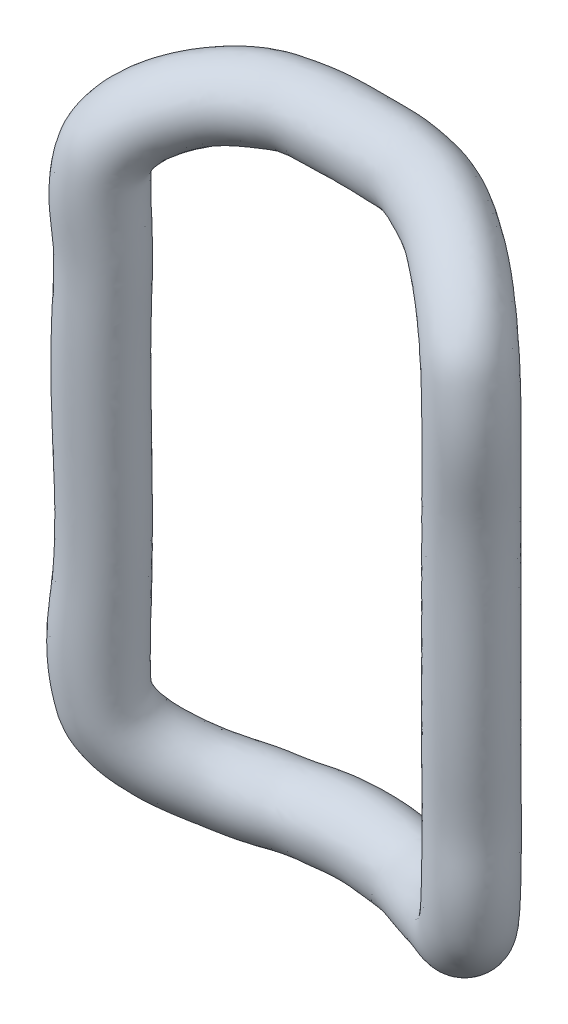
ISO-10303-21;
HEADER;
FILE_DESCRIPTION(('STEP AP214'),'2;1');
FILE_NAME('part.step','',(''),(''),'','','');
FILE_SCHEMA(('AUTOMOTIVE_DESIGN { 1 0 10303 214 1 1 1 1 }'));
ENDSEC;
DATA;
#1=APPLICATION_CONTEXT('core data for automotive mechanical design processes');
#2=APPLICATION_PROTOCOL_DEFINITION('international standard','automotive_design',2000,#1);
#3=PRODUCT_CONTEXT('',#1,'mechanical');
#4=PRODUCT('Part','Part','',(#3));
#5=PRODUCT_RELATED_PRODUCT_CATEGORY('part','',(#4));
#6=PRODUCT_DEFINITION_FORMATION('','',#4);
#7=PRODUCT_DEFINITION_CONTEXT('part definition',#1,'design');
#8=PRODUCT_DEFINITION('design','',#6,#7);
#9=PRODUCT_DEFINITION_SHAPE('','',#8);
#10=(LENGTH_UNIT() NAMED_UNIT(*) SI_UNIT(.MILLI.,.METRE.));
#11=(NAMED_UNIT(*) PLANE_ANGLE_UNIT() SI_UNIT($,.RADIAN.));
#12=(NAMED_UNIT(*) SI_UNIT($,.STERADIAN.) SOLID_ANGLE_UNIT());
#13=UNCERTAINTY_MEASURE_WITH_UNIT(LENGTH_MEASURE(1.E-05),#10,'distance_accuracy_value','');
#14=(GEOMETRIC_REPRESENTATION_CONTEXT(3) GLOBAL_UNCERTAINTY_ASSIGNED_CONTEXT((#13)) GLOBAL_UNIT_ASSIGNED_CONTEXT((#10,
#11,#12)) REPRESENTATION_CONTEXT('',''));
#15=CARTESIAN_POINT('',(0.,0.,0.));
#16=DIRECTION('',(0.,0.,1.));
#17=DIRECTION('',(1.,0.,0.));
#18=AXIS2_PLACEMENT_3D('',#15,#16,#17);
#19=CARTESIAN_POINT('',(-18.3847765,0.,3.5));
#20=CARTESIAN_POINT('',(-18.3199681216391,-4.26434446352197,3.42498522952667));
#21=CARTESIAN_POINT('',(-18.0907308019333,-12.0772699911316,3.18583140016544));
#22=CARTESIAN_POINT('',(-18.8792335916831,-19.4309618241525,3.97643772500778));
#23=CARTESIAN_POINT('',(-18.0456084451628,-24.7638662047518,3.29955777444112));
#24=CARTESIAN_POINT('',(-17.4582697647124,-26.4595995103626,2.70570113785694));
#25=CARTESIAN_POINT('',(-16.6517490208353,-27.9683030387842,1.90677910702819));
#26=CARTESIAN_POINT('',(-15.3970900155844,-29.7350333764055,0.611116282843514));
#27=CARTESIAN_POINT('',(-13.6343522341538,-31.5360264281087,-1.29487306531751));
#28=CARTESIAN_POINT('',(-11.5253626556801,-33.0715134462873,-4.1473295282415));
#29=CARTESIAN_POINT('',(-7.44557176480566,-33.9469582161014,-6.7633100794401));
#30=CARTESIAN_POINT('',(-4.42941727476016,-33.0161722485232,-9.60232705824264));
#31=CARTESIAN_POINT('',(-1.83569353914474E-07,-32.9942136555799,-9.33595733035491));
#32=CARTESIAN_POINT('',(4.4294181207768,-33.0161717814397,-9.60232626735857));
#33=CARTESIAN_POINT('',(7.44556788927764,-33.9469607276921,-6.7633143321632));
#34=CARTESIAN_POINT('',(11.5253753567605,-33.071505138721,-4.14731546154616));
#35=CARTESIAN_POINT('',(13.6343154323367,-31.53605051379,-1.29491384813247));
#36=CARTESIAN_POINT('',(15.3971866599789,-29.734970122501,0.611223386821527));
#37=CARTESIAN_POINT('',(16.6515994823351,-27.9684009121418,1.90661338404167));
#38=CARTESIAN_POINT('',(17.458819917612,-26.4592394337066,2.70631083369422));
#39=CARTESIAN_POINT('',(18.0435079873314,-24.7652409604673,3.29722998444665));
#40=CARTESIAN_POINT('',(18.7197795087196,-20.5650377230428,3.85284706791709));
#41=CARTESIAN_POINT('',(18.2257988263368,-16.1116521676983,3.27705751024279));
#42=CARTESIAN_POINT('',(18.4523675583633,-8.48395082199735,3.5945365118347));
#43=CARTESIAN_POINT('',(18.4235037525558,0.832481818886858,3.53004893807707));
#44=CARTESIAN_POINT('',(18.0917327589066,12.0775285039963,3.18577576878361));
#45=CARTESIAN_POINT('',(18.8807306910192,19.4305309597762,3.9765389629776));
#46=CARTESIAN_POINT('',(18.0469488175736,24.764289832287,3.29950060225985));
#47=CARTESIAN_POINT('',(17.4595097373242,26.460225049478,2.70550083143744));
#48=CARTESIAN_POINT('',(16.6528873500142,27.9690405414662,1.90642684157199));
#49=CARTESIAN_POINT('',(15.3981059276651,29.7358161322757,0.610542155393531));
#50=CARTESIAN_POINT('',(13.6352436466905,31.5367038879858,-1.29575447487858));
#51=CARTESIAN_POINT('',(11.5260902151138,33.0717597735155,-4.14852359548954));
#52=CARTESIAN_POINT('',(7.4459705560003,33.9469659553138,-6.76472573219841));
#53=CARTESIAN_POINT('',(4.42960822455482,33.0153007495258,-9.60345826949107));
#54=CARTESIAN_POINT('',(1.83597406550242E-07,32.9935613331794,-9.33718216088857));
#55=CARTESIAN_POINT('',(-4.42960907069897,33.0153002819153,-9.60345747847967));
#56=CARTESIAN_POINT('',(-7.44596667990414,33.9469684697271,-6.76472998558737));
#57=CARTESIAN_POINT('',(-11.5261029180816,33.0717514565961,-4.14850952656271));
#58=CARTESIAN_POINT('',(-13.6352068394375,31.5367280007623,-1.29579526412652));
#59=CARTESIAN_POINT('',(-15.3982025864582,29.7357528071326,0.610649276402808));
#60=CARTESIAN_POINT('',(-16.6527377894933,27.9691385248827,1.90626109251914));
#61=CARTESIAN_POINT('',(-17.460059964671,26.4598645722173,2.70611061589519));
#62=CARTESIAN_POINT('',(-18.0448481029488,24.7656660995131,3.29717250433012));
#63=CARTESIAN_POINT('',(-18.7212453398445,20.5647776298872,3.85291722632888));
#64=CARTESIAN_POINT('',(-18.2270311689196,16.1117392272097,3.27703541292297));
#65=CARTESIAN_POINT('',(-18.4542942461628,8.48393152043164,3.59454640211198));
#66=CARTESIAN_POINT('',(-18.435782047624,3.35612817540634,3.55903819142913));
#67=CARTESIAN_POINT('',(-18.3847765,0.,3.5));
#68=CARTESIAN_POINT('',(-11.3847765,0.,3.5));
#69=CARTESIAN_POINT('',(-11.3618805064437,-4.130102026507,3.47224927494235));
#70=CARTESIAN_POINT('',(-11.3072140778208,-10.9917261973871,3.43808594964652));
#71=CARTESIAN_POINT('',(-11.4696480004901,-21.2440940514686,3.50079056930574));
#72=CARTESIAN_POINT('',(-11.3210131079942,-22.6425153703427,3.5866026783748));
#73=CARTESIAN_POINT('',(-11.2187793751495,-23.3741035423916,3.68656959209981));
#74=CARTESIAN_POINT('',(-10.9289780655856,-24.2888278083942,3.65800461556978));
#75=CARTESIAN_POINT('',(-10.3081370621422,-25.8008576520519,3.49469953318343));
#76=CARTESIAN_POINT('',(-9.17081670780241,-28.1343645441324,3.13157511198948));
#77=CARTESIAN_POINT('',(-7.86158076316181,-31.8388331721998,1.82824700084484));
#78=CARTESIAN_POINT('',(-5.48164739548198,-33.905809514822,0.356342666751373));
#79=CARTESIAN_POINT('',(-3.41548678641442,-37.3803613507621,-3.94660883934488));
#80=CARTESIAN_POINT('',(-5.29997462752793E-08,-36.2664433375351,-3.18408878871942));
#81=CARTESIAN_POINT('',(3.4154870306746,-37.3803630455442,-3.94660864567258));
#82=CARTESIAN_POINT('',(5.48164627654767,-33.9058004016799,0.356341625341382));
#83=CARTESIAN_POINT('',(7.86158443019063,-31.8388633156584,1.82825044550829));
#84=CARTESIAN_POINT('',(9.17080608246,-28.1342771508189,3.13156512506143));
#85=CARTESIAN_POINT('',(10.3081649651061,-25.8010871646902,3.49472576088994));
#86=CARTESIAN_POINT('',(10.9289348911479,-24.2884726813422,3.65796403319359));
#87=CARTESIAN_POINT('',(11.2189382141242,-23.3754100568927,3.68671889489774));
#88=CARTESIAN_POINT('',(11.3204066682775,-22.6375271595036,3.58603264732145));
#89=CARTESIAN_POINT('',(11.4434095338543,-21.5920311172411,3.52463585393258));
#90=CARTESIAN_POINT('',(11.3054679482258,-15.7883003143208,3.37531846663573));
#91=CARTESIAN_POINT('',(11.4215538156536,-8.5961683238717,3.56032523274472));
#92=CARTESIAN_POINT('',(11.3887489822641,1.1159984662858,3.49294481291753));
#93=CARTESIAN_POINT('',(11.3081784924794,10.9924415521286,3.4400791118985));
#94=CARTESIAN_POINT('',(11.4712142233925,21.2429552506894,3.50380234257981));
#95=CARTESIAN_POINT('',(11.3223019625699,22.6436026452798,3.58927280647732));
#96=CARTESIAN_POINT('',(11.2199177801282,23.3757993627496,3.68895804461739));
#97=CARTESIAN_POINT('',(10.9299596961032,24.2909846568779,3.66006285766548));
#98=CARTESIAN_POINT('',(10.3089921529563,25.8034528212213,3.496262273932));
#99=CARTESIAN_POINT('',(9.17169755837351,28.1373158959622,3.13241280198794));
#100=CARTESIAN_POINT('',(7.86266786828979,31.8417844111128,1.8278033222603));
#101=CARTESIAN_POINT('',(5.48223565105549,33.9087521930164,0.354956488484557));
#102=CARTESIAN_POINT('',(3.4157676883837,37.3817710556489,-3.94948928863808));
#103=CARTESIAN_POINT('',(5.30486011473815E-08,36.2682320953656,-3.18661514056734));
#104=CARTESIAN_POINT('',(-3.41576793286873,37.3817727490895,-3.94948909472642));
#105=CARTESIAN_POINT('',(-5.48223453109628,33.9087430871274,0.354955445792105));
#106=CARTESIAN_POINT('',(-7.86267153868471,31.84181453064,1.82780677117335));
#107=CARTESIAN_POINT('',(-9.17168692328728,28.1372285721082,3.13240280274837));
#108=CARTESIAN_POINT('',(-10.309020081544,25.8036821517369,3.49628853400454));
#109=CARTESIAN_POINT('',(-10.9299164820924,24.2906298122383,3.66002222527909));
#110=CARTESIAN_POINT('',(-11.2200767627953,23.3771048226724,3.6891075296189));
#111=CARTESIAN_POINT('',(-11.3216949821716,22.638618525881,3.58870208723477));
#112=CARTESIAN_POINT('',(-11.4449212360665,21.5913333936021,3.52758073341665));
#113=CARTESIAN_POINT('',(-11.306688460976,15.7885224156753,3.37777797117603));
#114=CARTESIAN_POINT('',(-11.4234895491455,8.59614551970931,3.56417969818139));
#115=CARTESIAN_POINT('',(-11.4027961252286,3.25047657313661,3.521840400336));
#116=CARTESIAN_POINT('',(-11.3847765,0.,3.5));
#117=CARTESIAN_POINT('',(-11.3847765,0.,-3.5));
#118=CARTESIAN_POINT('',(-11.3829680020937,-3.96902474022357,-3.50075949842632));
#119=CARTESIAN_POINT('',(-11.407460929841,-9.77832139410785,-3.42230667474686));
#120=CARTESIAN_POINT('',(-11.2799633336875,-23.1295340767903,-3.76105252176092));
#121=CARTESIAN_POINT('',(-11.4510767361548,-20.9785075529565,-3.25718228918823));
#122=CARTESIAN_POINT('',(-11.4829898483927,-20.6776813394729,-2.79165554751246));
#123=CARTESIAN_POINT('',(-11.3266553013659,-20.729018777354,-2.38071618236801));
#124=CARTESIAN_POINT('',(-10.7109936763131,-21.2578557778583,-1.86617440237176));
#125=CARTESIAN_POINT('',(-9.197110003964,-22.4306321342314,-1.18180469222372));
#126=CARTESIAN_POINT('',(-6.96342699644522,-25.0613439199023,-0.0522441918762336));
#127=CARTESIAN_POINT('',(-5.00100093856361,-26.5375151555795,0.280364671172443));
#128=CARTESIAN_POINT('',(-3.19753557526607,-31.6693996724363,0.436404460780501));
#129=CARTESIAN_POINT('',(5.47589099085149E-09,-30.1385479808318,0.0799724554838378));
#130=CARTESIAN_POINT('',(3.19753555002928,-31.6694035748834,0.436404330621583));
#131=CARTESIAN_POINT('',(5.00100105417153,-26.5374941714332,0.280365371059945));
#132=CARTESIAN_POINT('',(6.96342661756924,-25.0614133289769,-0.0522465068886958));
#133=CARTESIAN_POINT('',(9.19711110177049,-22.4304309002238,-1.18179798043311));
#134=CARTESIAN_POINT('',(10.7109907933895,-21.2583842593445,-1.86619202890183));
#135=CARTESIAN_POINT('',(11.3266597621328,-20.7282010530089,-2.38068890867416));
#136=CARTESIAN_POINT('',(11.4829734372096,-20.6806897521234,-2.79175588759354));
#137=CARTESIAN_POINT('',(11.4511393932793,-20.9670215751312,-3.25679919548592));
#138=CARTESIAN_POINT('',(11.3161763907513,-22.7754247109068,-3.65629449556264));
#139=CARTESIAN_POINT('',(11.3385039429156,-15.4067611429853,-3.57254327580392));
#140=CARTESIAN_POINT('',(11.405243166137,-8.68285803283219,-3.45938951221597));
#141=CARTESIAN_POINT('',(11.3693809946959,1.41724248741743,-3.52956059470221));
#142=CARTESIAN_POINT('',(11.4064142494952,9.77859050134802,-3.42020698579541));
#143=CARTESIAN_POINT('',(11.2785488816733,23.1291569824192,-3.75823421643555));
#144=CARTESIAN_POINT('',(11.4496854723986,20.9787490264333,-3.25439729870341));
#145=CARTESIAN_POINT('',(11.4816403058167,20.6781405361617,-2.78887279574641));
#146=CARTESIAN_POINT('',(11.3253548551204,20.7297063638207,-2.37795758492358));
#147=CARTESIAN_POINT('',(10.7098190288299,21.2588831416863,-1.86346175476475));
#148=CARTESIAN_POINT('',(9.19621116316063,22.4322277787657,-1.17920246128038));
#149=CARTESIAN_POINT('',(6.96305273814158,25.0638036250598,-0.0503024640628697));
#150=CARTESIAN_POINT('',(5.0008055624048,26.5404416354531,0.281813793442094));
#151=CARTESIAN_POINT('',(3.19741279950962,31.6725515875235,0.43578330370224));
#152=CARTESIAN_POINT('',(-5.47834001324645E-09,30.1416413705655,0.0798966718076372));
#153=CARTESIAN_POINT('',(-3.19741277426194,31.6725554895306,0.435783173539091));
#154=CARTESIAN_POINT('',(-5.00080567806286,26.5404206537649,0.281814493349364));
#155=CARTESIAN_POINT('',(-6.96305235910072,25.0638730261428,-0.0503047791456837));
#156=CARTESIAN_POINT('',(-9.19621226144437,22.4320265681054,-1.17919574929199));
#157=CARTESIAN_POINT('',(-10.7098161446498,21.2594115625316,-1.86347938183701));
#158=CARTESIAN_POINT('',(-11.3253593178242,20.7288887347171,-2.37793031043806));
#159=CARTESIAN_POINT('',(-11.4816238877047,20.6811485625162,-2.7889731375426));
#160=CARTESIAN_POINT('',(-11.4497481551589,20.9672646734939,-3.25401420345769));
#161=CARTESIAN_POINT('',(-11.3147667224786,22.7751660330615,-3.65348327993529));
#162=CARTESIAN_POINT('',(-11.3372567480516,15.4068528410983,-3.57004161219326));
#163=CARTESIAN_POINT('',(-11.4033269384701,8.68285869358905,-3.45555397685349));
#164=CARTESIAN_POINT('',(-11.386199825632,3.12370538390971,-3.49940225887248));
#165=CARTESIAN_POINT('',(-11.3847765,0.,-3.5));
#166=CARTESIAN_POINT('',(-18.3847765,0.,-3.5));
#167=CARTESIAN_POINT('',(-18.341055617289,-4.10326717723854,-3.548023543842));
#168=CARTESIAN_POINT('',(-18.1909776539534,-10.8638651878523,-3.67456122422795));
#169=CARTESIAN_POINT('',(-18.6895489248805,-21.3164018494742,-3.28540536605887));
#170=CARTESIAN_POINT('',(-18.1756720733234,-23.0998583873656,-3.5442271931219));
#171=CARTESIAN_POINT('',(-17.7224802379556,-23.7631773074439,-3.77252400175532));
#172=CARTESIAN_POINT('',(-17.0494262566155,-24.408494007744,-4.13194169090961));
#173=CARTESIAN_POINT('',(-15.7999466297553,-25.1920315022119,-4.74975765271167));
#174=CARTESIAN_POINT('',(-13.6606455303154,-25.8322940182078,-5.6082528695307));
#175=CARTESIAN_POINT('',(-10.6272088889635,-26.2940241939898,-6.02782072096257));
#176=CARTESIAN_POINT('',(-6.9649253078873,-26.5786638568589,-6.83928807501904));
#177=CARTESIAN_POINT('',(-4.21146606361181,-27.3052105701975,-5.21931375811726));
#178=CARTESIAN_POINT('',(-1.25093716268846E-07,-26.8663182988765,-6.07189608615165));
#179=CARTESIAN_POINT('',(4.21146664013149,-27.3052123107789,-5.21931329106441));
#180=CARTESIAN_POINT('',(6.9649226669015,-26.5786544974454,-6.83929058644463));
#181=CARTESIAN_POINT('',(10.6272175441391,-26.2940551520396,-6.02781241394315));
#182=CARTESIAN_POINT('',(13.6606204516472,-25.8322042631949,-5.60827695362701));
#183=CARTESIAN_POINT('',(15.8000124882623,-25.1922672171553,-4.74969440297024));
#184=CARTESIAN_POINT('',(17.04932435332,-24.4081292838086,-4.13203955782609));
#185=CARTESIAN_POINT('',(17.7228551406974,-23.7645191289372,-3.77216394879706));
#186=CARTESIAN_POINT('',(18.1742407123331,-23.0947353760949,-3.54560185836073));
#187=CARTESIAN_POINT('',(18.5925463656166,-21.7484313167085,-3.32808328157814));
#188=CARTESIAN_POINT('',(18.2588348210265,-15.7301129963628,-3.67080423219686));
#189=CARTESIAN_POINT('',(18.4360569088468,-8.57064053095784,-3.42517823312599));
#190=CARTESIAN_POINT('',(18.4041357649876,1.13372584001849,-3.49245646954266));
#191=CARTESIAN_POINT('',(18.1899685159224,10.8636774532157,-3.6745103289103));
#192=CARTESIAN_POINT('',(18.6880653493,21.3167326915061,-3.28549759603776));
#193=CARTESIAN_POINT('',(18.1743323274023,23.0994362134406,-3.54416950292088));
#194=CARTESIAN_POINT('',(17.7212322630126,23.7625662228901,-3.77233000892636));
#195=CARTESIAN_POINT('',(17.0482825090314,24.407762248409,-4.13159360101707));
#196=CARTESIAN_POINT('',(15.7989328035387,25.1912464527407,-4.74918187330321));
#197=CARTESIAN_POINT('',(13.6597572514777,25.8316157707894,-5.60736973814691));
#198=CARTESIAN_POINT('',(10.6264750849656,26.2937789874625,-6.02662938181272));
#199=CARTESIAN_POINT('',(6.96454046734961,26.5786553977506,-6.83786842724088));
#200=CARTESIAN_POINT('',(4.21125333568074,27.3060812814005,-5.21818567715074));
#201=CARTESIAN_POINT('',(1.25070465347448E-07,26.8669706083793,-6.07067034851359));
#202=CARTESIAN_POINT('',(-4.21125391209218,27.3060830223564,-5.21818521021416));
#203=CARTESIAN_POINT('',(-6.96453782687071,26.5786460363646,-6.83787093803011));
#204=CARTESIAN_POINT('',(-10.6264837384976,26.2938099520989,-6.02662107688174));
#205=CARTESIAN_POINT('',(-13.6597321775946,25.8315259967596,-5.60739381616689));
#206=CARTESIAN_POINT('',(-15.798998649564,25.1914822179273,-4.74911863943875));
#207=CARTESIAN_POINT('',(-17.0481806252251,24.4073974473615,-4.13169144319801));
#208=CARTESIAN_POINT('',(-17.7216070895804,23.7639083120611,-3.77197005126631));
#209=CARTESIAN_POINT('',(-18.172901275936,23.094312247126,-3.54554378636234));
#210=CARTESIAN_POINT('',(-18.5910908262567,21.7486102693466,-3.32814678702306));
#211=CARTESIAN_POINT('',(-18.2575994559952,15.7300696526327,-3.67078417044633));
#212=CARTESIAN_POINT('',(-18.4341316354874,8.57064469431138,-3.4251872729229));
#213=CARTESIAN_POINT('',(-18.4191857480275,3.22935698617944,-3.46220446777935));
#214=CARTESIAN_POINT('',(-18.3847765,0.,-3.5));
#215=CARTESIAN_POINT('',(-25.3847765,0.,-3.5));
#216=CARTESIAN_POINT('',(-25.2991432324844,-4.2375096142535,-3.59528758925768));
#217=CARTESIAN_POINT('',(-24.9744943780659,-11.9494089815968,-3.92681577370903));
#218=CARTESIAN_POINT('',(-26.0991345160735,-19.5032696221581,-2.80975821035682));
#219=CARTESIAN_POINT('',(-24.900267410492,-25.2212092217747,-3.83127209705558));
#220=CARTESIAN_POINT('',(-23.9619706275184,-26.8486732754149,-4.75339245599819));
#221=CARTESIAN_POINT('',(-22.7721972118651,-28.087969238134,-5.88316719945121));
#222=CARTESIAN_POINT('',(-20.8888995831975,-29.1262072265656,-7.63334090305159));
#223=CARTESIAN_POINT('',(-18.1241810566668,-29.2339559021841,-10.0347010468377));
#224=CARTESIAN_POINT('',(-14.2909907814818,-27.5267044680773,-12.0033972500489));
#225=CARTESIAN_POINT('',(-8.92884967721098,-26.6198125581382,-13.9589408212105));
#226=CARTESIAN_POINT('',(-5.22539655195755,-22.9410214679586,-10.875031977015));
#227=CARTESIAN_POINT('',(-2.55663324287538E-07,-23.5940886169213,-12.2237646277871));
#228=CARTESIAN_POINT('',(5.22539773023369,-22.9410210466744,-10.8750309127504));
#229=CARTESIAN_POINT('',(8.92884427963148,-26.6198148234576,-13.9589465439492));
#230=CARTESIAN_POINT('',(14.2910084707089,-27.5266969751023,-12.0033783209976));
#231=CARTESIAN_POINT('',(18.1241298015239,-29.233977626166,-10.0347559268209));
#232=CARTESIAN_POINT('',(20.8890341831352,-29.1261501749661,-7.63319677703865));
#233=CARTESIAN_POINT('',(22.7719889445072,-28.0880575146083,-5.88339020697802));
#234=CARTESIAN_POINT('',(23.9627368441852,-26.8483485057511,-4.75257201000058));
#235=CARTESIAN_POINT('',(24.8973420313869,-25.2224491770586,-3.83440452123553));
#236=CARTESIAN_POINT('',(25.8689163404819,-20.7214379225102,-2.99987206759363));
#237=CARTESIAN_POINT('',(25.1791656991374,-16.0534648497404,-3.7690651885898));
#238=CARTESIAN_POINT('',(25.4668706515565,-8.45842302908348,-3.39096695403601));
#239=CARTESIAN_POINT('',(25.4388905352793,0.850209192619554,-3.45535234438312));
#240=CARTESIAN_POINT('',(24.9735227823495,11.9487644050834,-3.92881367202519));
#241=CARTESIAN_POINT('',(26.0975818169268,19.5043084005929,-2.81276097563997));
#242=CARTESIAN_POINT('',(24.8989791824059,25.2201234004478,-3.83394170713836));
#243=CARTESIAN_POINT('',(23.9608242202085,26.8469919096184,-4.7557872221063));
#244=CARTESIAN_POINT('',(22.7712101629423,28.0858181329973,-5.88522961711057));
#245=CARTESIAN_POINT('',(20.8880465782475,29.1236097637951,-7.63490199184167));
#246=CARTESIAN_POINT('',(18.1233033397947,29.231003762813,-10.0355370150134));
#247=CARTESIAN_POINT('',(14.2898974317896,27.5237543498651,-12.0029562995626));
#248=CARTESIAN_POINT('',(8.92827537229442,26.6168691600481,-13.9575506479239));
#249=CARTESIAN_POINT('',(5.22509387185185,22.9396109752775,-10.8721546580037));
#250=CARTESIAN_POINT('',(2.55619270202146E-07,23.5922998461931,-12.2212373688348));
#251=CARTESIAN_POINT('',(-5.22509504992242,22.9396105551822,-10.8721535939674));
#252=CARTESIAN_POINT('',(-8.92826997567857,26.6168714189644,-13.9575563694096));
#253=CARTESIAN_POINT('',(-14.2899151178944,27.5237468780551,-12.0029373746178));
#254=CARTESIAN_POINT('',(-18.1232520937449,29.2310254254137,-10.0355918830418));
#255=CARTESIAN_POINT('',(-20.8881811544782,29.123552873323,-7.63475789704049));
#256=CARTESIAN_POINT('',(-22.7710019326261,28.0859061600059,-5.88545257595796));
#257=CARTESIAN_POINT('',(-23.9615902914561,26.8466680616059,-4.75496696499003));
#258=CARTESIAN_POINT('',(-24.8960543967131,25.2213598207581,-3.83707336926699));
#259=CARTESIAN_POINT('',(-25.8674149300347,20.7220545056317,-3.00281029411083));
#260=CARTESIAN_POINT('',(-25.1779421639389,16.0532864641671,-3.77152672869939));
#261=CARTESIAN_POINT('',(-25.4649363325046,8.45843069503371,-3.39482056899231));
#262=CARTESIAN_POINT('',(-25.452171670423,3.33500858844917,-3.42500667668622));
#263=CARTESIAN_POINT('',(-25.3847765,0.,-3.5));
#264=CARTESIAN_POINT('',(-25.3847765,0.,3.5));
#265=CARTESIAN_POINT('',(-25.2780557368345,-4.39858690053694,3.37772118411099));
#266=CARTESIAN_POINT('',(-24.8742475260457,-13.162813784876,2.93357685068435));
#267=CARTESIAN_POINT('',(-26.2888191828761,-17.6178295968364,4.45208488070983));
#268=CARTESIAN_POINT('',(-24.7702037823314,-26.8852170391608,3.01251287050745));
#269=CARTESIAN_POINT('',(-23.6977601542753,-29.5450954783336,1.72483268361408));
#270=CARTESIAN_POINT('',(-22.3745199760849,-31.6477782691741,0.155553598486586));
#271=CARTESIAN_POINT('',(-20.4860429690266,-33.6692091007592,-2.2724669674964));
#272=CARTESIAN_POINT('',(-18.0978877605052,-34.937688312085,-5.72132124262449));
#273=CARTESIAN_POINT('',(-15.1891445481984,-34.3041937203748,-10.1229060573278));
#274=CARTESIAN_POINT('',(-9.40949613412935,-33.9881069173808,-13.8829628256316));
#275=CARTESIAN_POINT('',(-5.44334776310591,-28.6519831462843,-15.2580452771404));
#276=CARTESIAN_POINT('',(-3.14138960921174E-07,-29.7219839736247,-15.4878258719904));
#277=CARTESIAN_POINT('',(5.443349210879,-28.6519805173351,-15.2580438890446));
#278=CARTESIAN_POINT('',(9.40948950200762,-33.9881210537043,-13.8829702896678));
#279=CARTESIAN_POINT('',(15.1891662833303,-34.3041469617837,-10.1228813686006));
#280=CARTESIAN_POINT('',(18.0978247822134,-34.9378238767611,-5.72139282132636));
#281=CARTESIAN_POINT('',(20.4862083548517,-33.6688530803119,-2.27227898724689));
#282=CARTESIAN_POINT('',(22.3742640735223,-31.6483291429415,0.155262734889737));
#283=CARTESIAN_POINT('',(23.6987016210998,-29.5430688105204,1.7259027724907));
#284=CARTESIAN_POINT('',(24.7666093063852,-26.8929547614311,3.00842732157184));
#285=CARTESIAN_POINT('',(25.9961494835849,-19.5380443288445,4.18105828190159));
#286=CARTESIAN_POINT('',(25.1461297044477,-16.4350040210758,3.17879655384985));
#287=CARTESIAN_POINT('',(25.483181301073,-8.37173332012299,3.62874779092468));
#288=CARTESIAN_POINT('',(25.4582585228475,0.548965171487918,3.56715306323661));
#289=CARTESIAN_POINT('',(24.8752870253338,13.162615455864,2.93147242566873));
#290=CARTESIAN_POINT('',(26.2902471586459,17.6181066688631,4.44927558337539));
#291=CARTESIAN_POINT('',(24.7715956725773,26.8849770192943,3.00972839804237));
#292=CARTESIAN_POINT('',(23.6991016945201,29.5446507362063,1.7220436182575));
#293=CARTESIAN_POINT('',(22.3758150039252,31.6470964260545,0.152790825478494));
#294=CARTESIAN_POINT('',(20.4872197023739,33.6681794433301,-2.27517796314493));
#295=CARTESIAN_POINT('',(18.0987897350076,34.9360918800095,-5.7239217517451));
#296=CARTESIAN_POINT('',(15.1895125619378,34.3017351359182,-10.1248505132394));
#297=CARTESIAN_POINT('',(9.4097054609451,33.9851797176113,-13.8844079528814));
#298=CARTESIAN_POINT('',(5.44344876072593,28.6488304434028,-15.257427250344));
#299=CARTESIAN_POINT('',(3.1414621199527E-07,29.7188905709931,-15.4877491812098));
#300=CARTESIAN_POINT('',(-5.44345020852921,28.6488278147411,-15.2574258622329));
#301=CARTESIAN_POINT('',(-9.40969882871199,33.9851938523268,-13.8844154169668));
#302=CARTESIAN_POINT('',(-15.1895342974784,34.3016883825523,-10.1248258242988));
#303=CARTESIAN_POINT('',(-18.0987267555878,34.9362274294164,-5.72399333100142));
#304=CARTESIAN_POINT('',(-20.4873850913724,33.6678234625282,-2.27498998119893));
#305=CARTESIAN_POINT('',(-22.3755590968943,31.6476472375271,0.152499959759196));
#306=CARTESIAN_POINT('',(-23.7000431665468,29.5426243217621,1.72311370217147));
#307=CARTESIAN_POINT('',(-24.7680012237259,26.8927136731452,3.00564292142547));
#308=CARTESIAN_POINT('',(-25.9975694436225,19.5382218661724,4.17825371924111));
#309=CARTESIAN_POINT('',(-25.1473738768633,16.4349560387441,3.1762928546699));
#310=CARTESIAN_POINT('',(-25.4850989431801,8.37171752115396,3.62491310604257));
#311=CARTESIAN_POINT('',(-25.4687679700195,3.46177977767607,3.59623598252227));
#312=CARTESIAN_POINT('',(-25.3847765,0.,3.5));
#313=CARTESIAN_POINT('',(-18.3847765,0.,3.5));
#314=CARTESIAN_POINT('',(-18.3199681216391,-4.26434446352197,3.42498522952667));
#315=CARTESIAN_POINT('',(-18.0907308019333,-12.0772699911316,3.18583140016544));
#316=CARTESIAN_POINT('',(-18.8792335916831,-19.4309618241525,3.97643772500778));
#317=CARTESIAN_POINT('',(-18.0456084451628,-24.7638662047518,3.29955777444112));
#318=CARTESIAN_POINT('',(-17.4582697647124,-26.4595995103626,2.70570113785694));
#319=CARTESIAN_POINT('',(-16.6517490208353,-27.9683030387842,1.90677910702819));
#320=CARTESIAN_POINT('',(-15.3970900155844,-29.7350333764055,0.611116282843514));
#321=CARTESIAN_POINT('',(-13.6343522341538,-31.5360264281087,-1.29487306531751));
#322=CARTESIAN_POINT('',(-11.5253626556801,-33.0715134462873,-4.1473295282415));
#323=CARTESIAN_POINT('',(-7.44557176480566,-33.9469582161014,-6.7633100794401));
#324=CARTESIAN_POINT('',(-4.42941727476016,-33.0161722485232,-9.60232705824264));
#325=CARTESIAN_POINT('',(-1.83569353914474E-07,-32.9942136555799,-9.33595733035491));
#326=CARTESIAN_POINT('',(4.4294181207768,-33.0161717814397,-9.60232626735857));
#327=CARTESIAN_POINT('',(7.44556788927764,-33.9469607276921,-6.7633143321632));
#328=CARTESIAN_POINT('',(11.5253753567605,-33.071505138721,-4.14731546154616));
#329=CARTESIAN_POINT('',(13.6343154323367,-31.53605051379,-1.29491384813247));
#330=CARTESIAN_POINT('',(15.3971866599789,-29.734970122501,0.611223386821527));
#331=CARTESIAN_POINT('',(16.6515994823351,-27.9684009121418,1.90661338404167));
#332=CARTESIAN_POINT('',(17.458819917612,-26.4592394337066,2.70631083369422));
#333=CARTESIAN_POINT('',(18.0435079873314,-24.7652409604673,3.29722998444665));
#334=CARTESIAN_POINT('',(18.7197795087196,-20.5650377230428,3.85284706791709));
#335=CARTESIAN_POINT('',(18.2257988263368,-16.1116521676983,3.27705751024279));
#336=CARTESIAN_POINT('',(18.4523675583633,-8.48395082199735,3.5945365118347));
#337=CARTESIAN_POINT('',(18.4235037525558,0.832481818886858,3.53004893807707));
#338=CARTESIAN_POINT('',(18.0917327589066,12.0775285039963,3.18577576878361));
#339=CARTESIAN_POINT('',(18.8807306910192,19.4305309597762,3.9765389629776));
#340=CARTESIAN_POINT('',(18.0469488175736,24.764289832287,3.29950060225985));
#341=CARTESIAN_POINT('',(17.4595097373242,26.460225049478,2.70550083143744));
#342=CARTESIAN_POINT('',(16.6528873500142,27.9690405414662,1.90642684157199));
#343=CARTESIAN_POINT('',(15.3981059276651,29.7358161322757,0.610542155393531));
#344=CARTESIAN_POINT('',(13.6352436466905,31.5367038879858,-1.29575447487858));
#345=CARTESIAN_POINT('',(11.5260902151138,33.0717597735155,-4.14852359548954));
#346=CARTESIAN_POINT('',(7.4459705560003,33.9469659553138,-6.76472573219841));
#347=CARTESIAN_POINT('',(4.42960822455482,33.0153007495258,-9.60345826949107));
#348=CARTESIAN_POINT('',(1.83597406550242E-07,32.9935613331794,-9.33718216088857));
#349=CARTESIAN_POINT('',(-4.42960907069897,33.0153002819153,-9.60345747847967));
#350=CARTESIAN_POINT('',(-7.44596667990414,33.9469684697271,-6.76472998558737));
#351=CARTESIAN_POINT('',(-11.5261029180816,33.0717514565961,-4.14850952656271));
#352=CARTESIAN_POINT('',(-13.6352068394375,31.5367280007623,-1.29579526412652));
#353=CARTESIAN_POINT('',(-15.3982025864582,29.7357528071326,0.610649276402808));
#354=CARTESIAN_POINT('',(-16.6527377894933,27.9691385248827,1.90626109251914));
#355=CARTESIAN_POINT('',(-17.460059964671,26.4598645722173,2.70611061589519));
#356=CARTESIAN_POINT('',(-18.0448481029488,24.7656660995131,3.29717250433012));
#357=CARTESIAN_POINT('',(-18.7212453398445,20.5647776298872,3.85291722632888));
#358=CARTESIAN_POINT('',(-18.2270311689196,16.1117392272097,3.27703541292297));
#359=CARTESIAN_POINT('',(-18.4542942461628,8.48393152043164,3.59454640211198));
#360=CARTESIAN_POINT('',(-18.435782047624,3.35612817540634,3.55903819142913));
#361=CARTESIAN_POINT('',(-18.3847765,0.,3.5));
#362=(BOUNDED_SURFACE() B_SPLINE_SURFACE(3,3,((#19,#20,#21,#22,#23,#24,#25,#26,#27,#28,#29,#30,
#31,#32,#33,#34,#35,#36,#37,#38,#39,#40,#41,#42,#43,#44,#45,#46,#47,#48,#49,#50,#51,#52,#53,#54,
#55,#56,#57,#58,#59,#60,#61,#62,#63,#64,#65,#66,#67),(#68,#69,#70,#71,#72,#73,#74,#75,#76,#77,
#78,#79,#80,#81,#82,#83,#84,#85,#86,#87,#88,#89,#90,#91,#92,#93,#94,#95,#96,#97,#98,#99,#100,
#101,#102,#103,#104,#105,#106,#107,#108,#109,#110,#111,#112,#113,#114,#115,#116),(#117,#118,
#119,#120,#121,#122,#123,#124,#125,#126,#127,#128,#129,#130,#131,#132,#133,#134,#135,#136,#137,
#138,#139,#140,#141,#142,#143,#144,#145,#146,#147,#148,#149,#150,#151,#152,#153,#154,#155,#156,
#157,#158,#159,#160,#161,#162,#163,#164,#165),(#166,#167,#168,#169,#170,#171,#172,#173,#174,
#175,#176,#177,#178,#179,#180,#181,#182,#183,#184,#185,#186,#187,#188,#189,#190,#191,#192,#193,
#194,#195,#196,#197,#198,#199,#200,#201,#202,#203,#204,#205,#206,#207,#208,#209,#210,#211,#212,
#213,#214),(#215,#216,#217,#218,#219,#220,#221,#222,#223,#224,#225,#226,#227,#228,#229,#230,
#231,#232,#233,#234,#235,#236,#237,#238,#239,#240,#241,#242,#243,#244,#245,#246,#247,#248,#249,
#250,#251,#252,#253,#254,#255,#256,#257,#258,#259,#260,#261,#262,#263),(#264,#265,#266,#267,
#268,#269,#270,#271,#272,#273,#274,#275,#276,#277,#278,#279,#280,#281,#282,#283,#284,#285,#286,
#287,#288,#289,#290,#291,#292,#293,#294,#295,#296,#297,#298,#299,#300,#301,#302,#303,#304,#305,
#306,#307,#308,#309,#310,#311,#312),(#313,#314,#315,#316,#317,#318,#319,#320,#321,#322,#323,
#324,#325,#326,#327,#328,#329,#330,#331,#332,#333,#334,#335,#336,#337,#338,#339,#340,#341,#342,
#343,#344,#345,#346,#347,#348,#349,#350,#351,#352,#353,#354,#355,#356,#357,#358,#359,#360,
#361)),.UNSPECIFIED.,.T.,.T.,.F.) B_SPLINE_SURFACE_WITH_KNOTS((4,3,4),(4,1,1,1,1,1,1,1,1,1,1,1,
1,1,1,1,1,1,1,1,1,1,1,1,1,1,1,1,1,1,1,1,1,1,1,1,1,1,1,1,1,1,1,1,1,1,4),(0.,0.5,1.),(0.,
0.0636464094896848,0.114038012374954,0.122080085124412,0.129967827792619,0.137775253041128,
0.145892659980601,0.163671350334469,0.183115587943865,0.206750550894227,0.231229870929204,
0.249997291033424,0.268764711137645,0.293244031172622,0.316878994122984,0.33632323173238,
0.354101922086248,0.362219329025722,0.370026754274231,0.377914496942438,0.385956569691895,
0.422082910208788,0.449908584068772,0.49999962567211,0.56364604323842,0.614037751350985,
0.622079712231605,0.629967354816812,0.637774770175054,0.645892217781839,0.663670986097728,
0.683115289503278,0.706750358656515,0.731229737894129,0.749997287734837,0.768764837575546,
0.793244216813161,0.816879285966397,0.836323589371947,0.854102357687837,0.862219805294622,
0.870027220652863,0.877914863238071,0.885956824118692,0.922083275190536,0.949908946151278,1.),
.UNSPECIFIED.) GEOMETRIC_REPRESENTATION_ITEM() RATIONAL_B_SPLINE_SURFACE(((1.,1.,1.,1.,1.,1.,1.,
1.,1.,1.,1.,1.,1.,1.,1.,1.,1.,1.,1.,1.,1.,0.999999999999999,1.,1.,1.,1.,1.,1.,1.,1.,1.,1.,1.,1.,
1.,1.,1.,1.,1.,1.,1.,1.,1.,1.,0.999999999999999,1.,1.,1.,1.),(0.333333333333333,
0.333333333333333,0.333333333333333,0.333333333333333,0.333333333333333,0.333333333333333,
0.333333333333333,0.333333333333333,0.333333333333333,0.333333333333333,0.333333333333333,
0.333333333333333,0.333333333333333,0.333333333333333,0.333333333333333,0.333333333333333,
0.333333333333333,0.333333333333333,0.333333333333333,0.333333333333333,0.333333333333333,
0.333333333333333,0.333333333333333,0.333333333333333,0.333333333333333,0.333333333333333,
0.333333333333334,0.333333333333333,0.333333333333333,0.333333333333333,0.333333333333333,
0.333333333333333,0.333333333333333,0.333333333333333,0.333333333333333,0.333333333333333,
0.333333333333333,0.333333333333333,0.333333333333333,0.333333333333333,0.333333333333333,
0.333333333333333,0.333333333333333,0.333333333333333,0.333333333333333,0.333333333333333,
0.333333333333333,0.333333333333333,0.333333333333333),(0.333333333333333,0.333333333333333,
0.333333333333333,0.333333333333333,0.333333333333333,0.333333333333333,0.333333333333333,
0.333333333333333,0.333333333333333,0.333333333333333,0.333333333333333,0.333333333333333,
0.333333333333333,0.333333333333333,0.333333333333333,0.333333333333333,0.333333333333333,
0.333333333333333,0.333333333333333,0.333333333333333,0.333333333333333,0.333333333333333,
0.333333333333333,0.333333333333333,0.333333333333333,0.333333333333333,0.333333333333334,
0.333333333333333,0.333333333333333,0.333333333333333,0.333333333333333,0.333333333333333,
0.333333333333333,0.333333333333333,0.333333333333333,0.333333333333333,0.333333333333333,
0.333333333333333,0.333333333333333,0.333333333333333,0.333333333333333,0.333333333333333,
0.333333333333333,0.333333333333333,0.333333333333333,0.333333333333333,0.333333333333333,
0.333333333333333,0.333333333333333),(1.,1.,1.,1.,1.,1.,1.,1.,1.,1.,1.,1.,1.,1.,1.,1.,1.,1.,1.,
1.,1.,0.999999999999999,1.,1.,1.,1.,1.,1.,1.,1.,1.,1.,1.,1.,1.,1.,1.,1.,1.,1.,1.,1.,1.,1.,
0.999999999999999,1.,1.,1.,1.),(0.333333333333333,0.333333333333333,0.333333333333333,
0.333333333333333,0.333333333333333,0.333333333333333,0.333333333333333,0.333333333333333,
0.333333333333333,0.333333333333333,0.333333333333333,0.333333333333333,0.333333333333333,
0.333333333333333,0.333333333333333,0.333333333333333,0.333333333333333,0.333333333333333,
0.333333333333333,0.333333333333333,0.333333333333333,0.333333333333333,0.333333333333333,
0.333333333333333,0.333333333333333,0.333333333333333,0.333333333333334,0.333333333333333,
0.333333333333333,0.333333333333333,0.333333333333333,0.333333333333333,0.333333333333333,
0.333333333333333,0.333333333333333,0.333333333333333,0.333333333333333,0.333333333333333,
0.333333333333333,0.333333333333333,0.333333333333333,0.333333333333333,0.333333333333333,
0.333333333333333,0.333333333333333,0.333333333333333,0.333333333333333,0.333333333333333,
0.333333333333333),(0.333333333333333,0.333333333333333,0.333333333333333,0.333333333333333,
0.333333333333333,0.333333333333333,0.333333333333333,0.333333333333333,0.333333333333333,
0.333333333333333,0.333333333333333,0.333333333333333,0.333333333333333,0.333333333333333,
0.333333333333333,0.333333333333333,0.333333333333333,0.333333333333333,0.333333333333333,
0.333333333333333,0.333333333333333,0.333333333333333,0.333333333333333,0.333333333333333,
0.333333333333333,0.333333333333333,0.333333333333334,0.333333333333333,0.333333333333333,
0.333333333333333,0.333333333333333,0.333333333333333,0.333333333333333,0.333333333333333,
0.333333333333333,0.333333333333333,0.333333333333333,0.333333333333333,0.333333333333333,
0.333333333333333,0.333333333333333,0.333333333333333,0.333333333333333,0.333333333333333,
0.333333333333333,0.333333333333333,0.333333333333333,0.333333333333333,0.333333333333333),(1.,
1.,1.,1.,1.,1.,1.,1.,1.,1.,1.,1.,1.,1.,1.,1.,1.,1.,1.,1.,1.,0.999999999999999,1.,1.,1.,1.,1.,1.,
1.,1.,1.,1.,1.,1.,1.,1.,1.,1.,1.,1.,1.,1.,1.,1.,0.999999999999999,1.,1.,1.,1.))) REPRESENTATION_ITEM('') SURFACE());
#363=ADVANCED_FACE('F346',(),#362,.F.);
#364=CLOSED_SHELL('',(#363));
#365=MANIFOLD_SOLID_BREP('B2',#364);
#366=ADVANCED_BREP_SHAPE_REPRESENTATION('',(#18,#365),#14);
#367=SHAPE_DEFINITION_REPRESENTATION(#9,#366);
ENDSEC;
END-ISO-10303-21;
